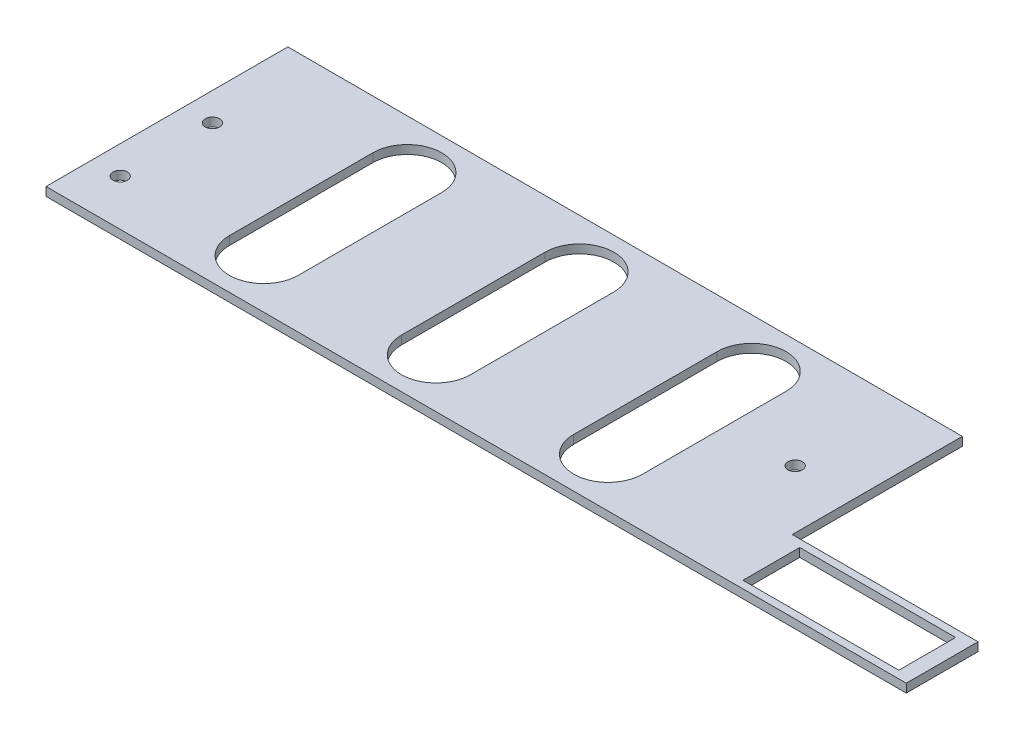
ISO-10303-21;
HEADER;
FILE_DESCRIPTION(('STEP AP214'),'2;1');
FILE_NAME('part.step','',(''),(''),'','','');
FILE_SCHEMA(('AUTOMOTIVE_DESIGN { 1 0 10303 214 1 1 1 1 }'));
ENDSEC;
DATA;
#1=APPLICATION_CONTEXT('core data for automotive mechanical design processes');
#2=APPLICATION_PROTOCOL_DEFINITION('international standard','automotive_design',2000,#1);
#3=PRODUCT_CONTEXT('',#1,'mechanical');
#4=PRODUCT('Part','Part','',(#3));
#5=PRODUCT_RELATED_PRODUCT_CATEGORY('part','',(#4));
#6=PRODUCT_DEFINITION_FORMATION('','',#4);
#7=PRODUCT_DEFINITION_CONTEXT('part definition',#1,'design');
#8=PRODUCT_DEFINITION('design','',#6,#7);
#9=PRODUCT_DEFINITION_SHAPE('','',#8);
#10=(LENGTH_UNIT() NAMED_UNIT(*) SI_UNIT(.MILLI.,.METRE.));
#11=(NAMED_UNIT(*) PLANE_ANGLE_UNIT() SI_UNIT($,.RADIAN.));
#12=(NAMED_UNIT(*) SI_UNIT($,.STERADIAN.) SOLID_ANGLE_UNIT());
#13=UNCERTAINTY_MEASURE_WITH_UNIT(LENGTH_MEASURE(1.E-05),#10,'distance_accuracy_value','');
#14=(GEOMETRIC_REPRESENTATION_CONTEXT(3) GLOBAL_UNCERTAINTY_ASSIGNED_CONTEXT((#13)) GLOBAL_UNIT_ASSIGNED_CONTEXT((#10,
#11,#12)) REPRESENTATION_CONTEXT('',''));
#15=CARTESIAN_POINT('',(0.,0.,0.));
#16=DIRECTION('',(0.,0.,1.));
#17=DIRECTION('',(1.,0.,0.));
#18=AXIS2_PLACEMENT_3D('',#15,#16,#17);
#19=CARTESIAN_POINT('',(0.,3.,0.));
#20=DIRECTION('',(0.,-1.,0.));
#21=DIRECTION('',(0.,0.,-1.));
#22=AXIS2_PLACEMENT_3D('',#19,#20,#21);
#23=PLANE('',#22);
#24=DIRECTION('',(0.,0.,1.));
#25=VECTOR('',#24,1.);
#26=CARTESIAN_POINT('',(29.5972683571293,3.,0.));
#27=LINE('',#26,#25);
#28=CARTESIAN_POINT('',(29.5972683571293,3.,-31.634999999999));
#29=VERTEX_POINT('',#28);
#30=CARTESIAN_POINT('',(29.5972683571293,3.,18.365000000001));
#31=VERTEX_POINT('',#30);
#32=EDGE_CURVE('E353',#29,#31,#27,.T.);
#33=ORIENTED_EDGE('',*,*,#32,.T.);
#34=CARTESIAN_POINT('',(17.5972683571293,3.,18.365000000001));
#35=DIRECTION('',(0.,-1.,0.));
#36=DIRECTION('',(0.,0.,-1.));
#37=AXIS2_PLACEMENT_3D('',#34,#35,#36);
#38=CIRCLE('',#37,12.);
#39=CARTESIAN_POINT('',(5.59726835712926,3.,18.365000000001));
#40=VERTEX_POINT('',#39);
#41=EDGE_CURVE('E357',#31,#40,#38,.T.);
#42=ORIENTED_EDGE('',*,*,#41,.T.);
#43=DIRECTION('',(0.,0.,-1.));
#44=VECTOR('',#43,1.);
#45=CARTESIAN_POINT('',(5.59726835712926,3.,0.));
#46=LINE('',#45,#44);
#47=CARTESIAN_POINT('',(5.59726835712927,3.,-31.634999999999));
#48=VERTEX_POINT('',#47);
#49=EDGE_CURVE('E345',#40,#48,#46,.T.);
#50=ORIENTED_EDGE('',*,*,#49,.T.);
#51=CARTESIAN_POINT('',(17.5972683571293,3.,-31.634999999999));
#52=DIRECTION('',(0.,-1.,0.));
#53=DIRECTION('',(0.,0.,-1.));
#54=AXIS2_PLACEMENT_3D('',#51,#52,#53);
#55=CIRCLE('',#54,12.);
#56=EDGE_CURVE('E349',#48,#29,#55,.T.);
#57=ORIENTED_EDGE('',*,*,#56,.T.);
#58=EDGE_LOOP('',(#33,#42,#50,#57));
#59=FACE_BOUND('',#58,.T.);
#60=DIRECTION('',(0.,0.,1.));
#61=VECTOR('',#60,1.);
#62=CARTESIAN_POINT('',(-90.4027316428707,3.,0.));
#63=LINE('',#62,#61);
#64=CARTESIAN_POINT('',(-90.4027316428707,3.,-31.6349999999999));
#65=VERTEX_POINT('',#64);
#66=CARTESIAN_POINT('',(-90.4027316428707,3.,18.3650000000001));
#67=VERTEX_POINT('',#66);
#68=EDGE_CURVE('E337',#65,#67,#63,.T.);
#69=ORIENTED_EDGE('',*,*,#68,.T.);
#70=CARTESIAN_POINT('',(-102.402731642871,3.,18.3650000000001));
#71=DIRECTION('',(0.,-1.,0.));
#72=DIRECTION('',(0.,0.,-1.));
#73=AXIS2_PLACEMENT_3D('',#70,#71,#72);
#74=CIRCLE('',#73,12.);
#75=CARTESIAN_POINT('',(-114.402731642871,3.,18.3650000000001));
#76=VERTEX_POINT('',#75);
#77=EDGE_CURVE('E341',#67,#76,#74,.T.);
#78=ORIENTED_EDGE('',*,*,#77,.T.);
#79=DIRECTION('',(0.,0.,-1.));
#80=VECTOR('',#79,1.);
#81=CARTESIAN_POINT('',(-114.402731642871,3.,0.));
#82=LINE('',#81,#80);
#83=CARTESIAN_POINT('',(-114.402731642871,3.,-31.6349999999999));
#84=VERTEX_POINT('',#83);
#85=EDGE_CURVE('E332',#76,#84,#82,.T.);
#86=ORIENTED_EDGE('',*,*,#85,.T.);
#87=CARTESIAN_POINT('',(-102.402731642871,3.,-31.6349999999999));
#88=DIRECTION('',(0.,-1.,0.));
#89=DIRECTION('',(0.,0.,-1.));
#90=AXIS2_PLACEMENT_3D('',#87,#88,#89);
#91=CIRCLE('',#90,12.);
#92=EDGE_CURVE('E231',#84,#65,#91,.T.);
#93=ORIENTED_EDGE('',*,*,#92,.T.);
#94=EDGE_LOOP('',(#69,#78,#86,#93));
#95=FACE_BOUND('',#94,.T.);
#96=DIRECTION('',(0.,0.,1.));
#97=VECTOR('',#96,1.);
#98=CARTESIAN_POINT('',(-30.4027316428707,3.,0.));
#99=LINE('',#98,#97);
#100=CARTESIAN_POINT('',(-30.4027316428707,3.,-31.6349999999995));
#101=VERTEX_POINT('',#100);
#102=CARTESIAN_POINT('',(-30.4027316428707,3.,18.3650000000005));
#103=VERTEX_POINT('',#102);
#104=EDGE_CURVE('E324',#101,#103,#99,.T.);
#105=ORIENTED_EDGE('',*,*,#104,.T.);
#106=CARTESIAN_POINT('',(-42.4027316428707,3.,18.3650000000005));
#107=DIRECTION('',(0.,-1.,0.));
#108=DIRECTION('',(0.,0.,-1.));
#109=AXIS2_PLACEMENT_3D('',#106,#107,#108);
#110=CIRCLE('',#109,12.);
#111=CARTESIAN_POINT('',(-54.4027316428707,3.,18.3650000000005));
#112=VERTEX_POINT('',#111);
#113=EDGE_CURVE('E328',#103,#112,#110,.T.);
#114=ORIENTED_EDGE('',*,*,#113,.T.);
#115=DIRECTION('',(0.,0.,-1.));
#116=VECTOR('',#115,1.);
#117=CARTESIAN_POINT('',(-54.4027316428707,3.,0.));
#118=LINE('',#117,#116);
#119=CARTESIAN_POINT('',(-54.4027316428707,3.,-31.6349999999995));
#120=VERTEX_POINT('',#119);
#121=EDGE_CURVE('E309',#112,#120,#118,.T.);
#122=ORIENTED_EDGE('',*,*,#121,.T.);
#123=CARTESIAN_POINT('',(-42.4027316428707,3.,-31.6349999999995));
#124=DIRECTION('',(0.,-1.,0.));
#125=DIRECTION('',(0.,0.,-1.));
#126=AXIS2_PLACEMENT_3D('',#123,#124,#125);
#127=CIRCLE('',#126,12.);
#128=EDGE_CURVE('E320',#120,#101,#127,.T.);
#129=ORIENTED_EDGE('',*,*,#128,.T.);
#130=EDGE_LOOP('',(#105,#114,#122,#129));
#131=FACE_BOUND('',#130,.T.);
#132=DIRECTION('',(0.,0.,1.));
#133=VECTOR('',#132,1.);
#134=CARTESIAN_POINT('',(79.1091633125255,3.,15.6877455438227));
#135=LINE('',#134,#133);
#136=CARTESIAN_POINT('',(79.1091633125255,3.,13.11));
#137=VERTEX_POINT('',#136);
#138=CARTESIAN_POINT('',(79.1091633125255,3.,32.8870446375442));
#139=VERTEX_POINT('',#138);
#140=EDGE_CURVE('E421',#137,#139,#135,.T.);
#141=ORIENTED_EDGE('',*,*,#140,.F.);
#142=DIRECTION('',(1.,0.,0.));
#143=VECTOR('',#142,1.);
#144=CARTESIAN_POINT('',(0.,3.,13.11));
#145=LINE('',#144,#143);
#146=CARTESIAN_POINT('',(133.425707504545,3.,13.11));
#147=VERTEX_POINT('',#146);
#148=EDGE_CURVE('E374',#137,#147,#145,.T.);
#149=ORIENTED_EDGE('',*,*,#148,.T.);
#150=DIRECTION('',(0.,0.,1.));
#151=VECTOR('',#150,1.);
#152=CARTESIAN_POINT('',(133.425707504545,3.,0.));
#153=LINE('',#152,#151);
#154=CARTESIAN_POINT('',(133.425707504545,3.,32.8870446375442));
#155=VERTEX_POINT('',#154);
#156=EDGE_CURVE('E384',#147,#155,#153,.T.);
#157=ORIENTED_EDGE('',*,*,#156,.T.);
#158=DIRECTION('',(1.,0.,0.));
#159=VECTOR('',#158,1.);
#160=CARTESIAN_POINT('',(114.261515643518,3.,32.8870446375442));
#161=LINE('',#160,#159);
#162=EDGE_CURVE('E424',#139,#155,#161,.T.);
#163=ORIENTED_EDGE('',*,*,#162,.F.);
#164=EDGE_LOOP('',(#141,#149,#157,#163));
#165=FACE_BOUND('',#164,.T.);
#166=CARTESIAN_POINT('',(53.6619509149034,3.,-10.7474999223063));
#167=DIRECTION('',(0.,1.,0.));
#168=DIRECTION('',(0.,0.,1.));
#169=AXIS2_PLACEMENT_3D('',#166,#167,#168);
#170=CIRCLE('',#169,2.50000000000001);
#171=CARTESIAN_POINT('',(53.6619509149034,3.,-8.24749992230629));
#172=VERTEX_POINT('',#171);
#173=EDGE_CURVE('E438',#172,#172,#170,.T.);
#174=ORIENTED_EDGE('',*,*,#173,.F.);
#175=EDGE_LOOP('',(#174));
#176=FACE_BOUND('',#175,.T.);
#177=DIRECTION('',(0.,0.,-1.));
#178=VECTOR('',#177,1.);
#179=CARTESIAN_POINT('',(73.9119509148827,3.,-28.7699999999858));
#180=LINE('',#179,#178);
#181=CARTESIAN_POINT('',(73.9119509148827,3.,10.5));
#182=VERTEX_POINT('',#181);
#183=CARTESIAN_POINT('',(73.9119509148862,3.,-48.7699999999858));
#184=VERTEX_POINT('',#183);
#185=EDGE_CURVE('E459',#182,#184,#180,.T.);
#186=ORIENTED_EDGE('',*,*,#185,.T.);
#187=DIRECTION('',(1.,0.,0.));
#188=VECTOR('',#187,1.);
#189=CARTESIAN_POINT('',(73.9119509148862,3.,-48.7699999999858));
#190=LINE('',#189,#188);
#191=CARTESIAN_POINT('',(-161.174292495454,3.,-48.7699999999998));
#192=VERTEX_POINT('',#191);
#193=EDGE_CURVE('E400',#192,#184,#190,.T.);
#194=ORIENTED_EDGE('',*,*,#193,.F.);
#195=DIRECTION('',(0.,0.,1.));
#196=VECTOR('',#195,1.);
#197=CARTESIAN_POINT('',(-161.174292495455,3.,-28.7699999999998));
#198=LINE('',#197,#196);
#199=CARTESIAN_POINT('',(-161.174292495455,3.,35.5));
#200=VERTEX_POINT('',#199);
#201=EDGE_CURVE('E446',#192,#200,#198,.T.);
#202=ORIENTED_EDGE('',*,*,#201,.T.);
#203=DIRECTION('',(1.,0.,0.));
#204=VECTOR('',#203,1.);
#205=CARTESIAN_POINT('',(-161.174292495455,3.,35.5));
#206=LINE('',#205,#204);
#207=CARTESIAN_POINT('',(138.625707504545,3.,35.5));
#208=VERTEX_POINT('',#207);
#209=EDGE_CURVE('E449',#200,#208,#206,.T.);
#210=ORIENTED_EDGE('',*,*,#209,.T.);
#211=DIRECTION('',(0.,0.,-1.));
#212=VECTOR('',#211,1.);
#213=CARTESIAN_POINT('',(138.625707504545,3.,10.5));
#214=LINE('',#213,#212);
#215=CARTESIAN_POINT('',(138.625707504545,3.,10.5));
#216=VERTEX_POINT('',#215);
#217=EDGE_CURVE('E453',#208,#216,#214,.T.);
#218=ORIENTED_EDGE('',*,*,#217,.T.);
#219=DIRECTION('',(-1.,0.,0.));
#220=VECTOR('',#219,1.);
#221=CARTESIAN_POINT('',(73.9119509148827,3.,10.5));
#222=LINE('',#221,#220);
#223=EDGE_CURVE('E456',#216,#182,#222,.T.);
#224=ORIENTED_EDGE('',*,*,#223,.T.);
#225=EDGE_LOOP('',(#186,#194,#202,#210,#218,#224));
#226=FACE_BOUND('',#225,.T.);
#227=CARTESIAN_POINT('',(-151.374292495455,3.,19.4325000000002));
#228=DIRECTION('',(0.,1.,0.));
#229=DIRECTION('',(0.,0.,1.));
#230=AXIS2_PLACEMENT_3D('',#227,#228,#229);
#231=CIRCLE('',#230,2.5);
#232=CARTESIAN_POINT('',(-151.374292495455,3.,21.9325000000002));
#233=VERTEX_POINT('',#232);
#234=EDGE_CURVE('E413',#233,#233,#231,.T.);
#235=ORIENTED_EDGE('',*,*,#234,.F.);
#236=EDGE_LOOP('',(#235));
#237=FACE_BOUND('',#236,.T.);
#238=CARTESIAN_POINT('',(-151.374292495455,3.,-12.7024999999998));
#239=DIRECTION('',(0.,1.,0.));
#240=DIRECTION('',(0.,0.,1.));
#241=AXIS2_PLACEMENT_3D('',#238,#239,#240);
#242=CIRCLE('',#241,2.5);
#243=CARTESIAN_POINT('',(-151.374292495455,3.,-10.2024999999998));
#244=VERTEX_POINT('',#243);
#245=EDGE_CURVE('E405',#244,#244,#242,.T.);
#246=ORIENTED_EDGE('',*,*,#245,.F.);
#247=EDGE_LOOP('',(#246));
#248=FACE_BOUND('',#247,.T.);
#249=ADVANCED_FACE('F38',(#59,#95,#131,#165,#176,#226,#237,#248),#23,.F.);
#250=CARTESIAN_POINT('',(0.,0.,0.));
#251=DIRECTION('',(0.,-1.,0.));
#252=DIRECTION('',(0.,0.,-1.));
#253=AXIS2_PLACEMENT_3D('',#250,#251,#252);
#254=PLANE('',#253);
#255=CARTESIAN_POINT('',(17.5972683571293,0.,18.365000000001));
#256=DIRECTION('',(0.,-1.,0.));
#257=DIRECTION('',(0.,0.,-1.));
#258=AXIS2_PLACEMENT_3D('',#255,#256,#257);
#259=CIRCLE('',#258,12.);
#260=CARTESIAN_POINT('',(29.5972683571293,0.,18.365000000001));
#261=VERTEX_POINT('',#260);
#262=CARTESIAN_POINT('',(5.59726835712926,0.,18.365000000001));
#263=VERTEX_POINT('',#262);
#264=EDGE_CURVE('E266',#261,#263,#259,.T.);
#265=ORIENTED_EDGE('',*,*,#264,.F.);
#266=DIRECTION('',(0.,0.,1.));
#267=VECTOR('',#266,1.);
#268=CARTESIAN_POINT('',(29.5972683571293,0.,18.365000000001));
#269=LINE('',#268,#267);
#270=CARTESIAN_POINT('',(29.5972683571293,0.,-31.634999999999));
#271=VERTEX_POINT('',#270);
#272=EDGE_CURVE('E276',#271,#261,#269,.T.);
#273=ORIENTED_EDGE('',*,*,#272,.F.);
#274=CARTESIAN_POINT('',(17.5972683571293,0.,-31.634999999999));
#275=DIRECTION('',(0.,-1.,0.));
#276=DIRECTION('',(0.,0.,-1.));
#277=AXIS2_PLACEMENT_3D('',#274,#275,#276);
#278=CIRCLE('',#277,12.);
#279=CARTESIAN_POINT('',(5.59726835712927,0.,-31.634999999999));
#280=VERTEX_POINT('',#279);
#281=EDGE_CURVE('E272',#280,#271,#278,.T.);
#282=ORIENTED_EDGE('',*,*,#281,.F.);
#283=DIRECTION('',(0.,0.,-1.));
#284=VECTOR('',#283,1.);
#285=CARTESIAN_POINT('',(5.59726835712926,0.,18.365000000001));
#286=LINE('',#285,#284);
#287=EDGE_CURVE('E269',#263,#280,#286,.T.);
#288=ORIENTED_EDGE('',*,*,#287,.F.);
#289=EDGE_LOOP('',(#265,#273,#282,#288));
#290=FACE_BOUND('',#289,.T.);
#291=CARTESIAN_POINT('',(-102.402731642871,0.,18.3650000000001));
#292=DIRECTION('',(0.,-1.,0.));
#293=DIRECTION('',(0.,0.,-1.));
#294=AXIS2_PLACEMENT_3D('',#291,#292,#293);
#295=CIRCLE('',#294,12.);
#296=CARTESIAN_POINT('',(-90.4027316428707,0.,18.3650000000001));
#297=VERTEX_POINT('',#296);
#298=CARTESIAN_POINT('',(-114.402731642871,0.,18.3650000000001));
#299=VERTEX_POINT('',#298);
#300=EDGE_CURVE('E245',#297,#299,#295,.T.);
#301=ORIENTED_EDGE('',*,*,#300,.F.);
#302=DIRECTION('',(0.,0.,1.));
#303=VECTOR('',#302,1.);
#304=CARTESIAN_POINT('',(-90.4027316428707,0.,18.3650000000001));
#305=LINE('',#304,#303);
#306=CARTESIAN_POINT('',(-90.4027316428707,0.,-31.6349999999999));
#307=VERTEX_POINT('',#306);
#308=EDGE_CURVE('E250',#307,#297,#305,.T.);
#309=ORIENTED_EDGE('',*,*,#308,.F.);
#310=CARTESIAN_POINT('',(-102.402731642871,0.,-31.6349999999999));
#311=DIRECTION('',(0.,-1.,0.));
#312=DIRECTION('',(0.,0.,-1.));
#313=AXIS2_PLACEMENT_3D('',#310,#311,#312);
#314=CIRCLE('',#313,12.);
#315=CARTESIAN_POINT('',(-114.402731642871,0.,-31.6349999999999));
#316=VERTEX_POINT('',#315);
#317=EDGE_CURVE('E228',#316,#307,#314,.T.);
#318=ORIENTED_EDGE('',*,*,#317,.F.);
#319=DIRECTION('',(0.,0.,-1.));
#320=VECTOR('',#319,1.);
#321=CARTESIAN_POINT('',(-114.402731642871,0.,18.3650000000001));
#322=LINE('',#321,#320);
#323=EDGE_CURVE('E239',#299,#316,#322,.T.);
#324=ORIENTED_EDGE('',*,*,#323,.F.);
#325=EDGE_LOOP('',(#301,#309,#318,#324));
#326=FACE_BOUND('',#325,.T.);
#327=CARTESIAN_POINT('',(-42.4027316428707,0.,18.3650000000005));
#328=DIRECTION('',(0.,-1.,0.));
#329=DIRECTION('',(0.,0.,-1.));
#330=AXIS2_PLACEMENT_3D('',#327,#328,#329);
#331=CIRCLE('',#330,12.);
#332=CARTESIAN_POINT('',(-30.4027316428707,0.,18.3650000000005));
#333=VERTEX_POINT('',#332);
#334=CARTESIAN_POINT('',(-54.4027316428707,0.,18.3650000000005));
#335=VERTEX_POINT('',#334);
#336=EDGE_CURVE('E261',#333,#335,#331,.T.);
#337=ORIENTED_EDGE('',*,*,#336,.F.);
#338=DIRECTION('',(0.,0.,1.));
#339=VECTOR('',#338,1.);
#340=CARTESIAN_POINT('',(-30.4027316428707,0.,18.3650000000005));
#341=LINE('',#340,#339);
#342=CARTESIAN_POINT('',(-30.4027316428707,0.,-31.6349999999995));
#343=VERTEX_POINT('',#342);
#344=EDGE_CURVE('E301',#343,#333,#341,.T.);
#345=ORIENTED_EDGE('',*,*,#344,.F.);
#346=CARTESIAN_POINT('',(-42.4027316428707,0.,-31.6349999999995));
#347=DIRECTION('',(0.,-1.,0.));
#348=DIRECTION('',(0.,0.,-1.));
#349=AXIS2_PLACEMENT_3D('',#346,#347,#348);
#350=CIRCLE('',#349,12.);
#351=CARTESIAN_POINT('',(-54.4027316428707,0.,-31.6349999999995));
#352=VERTEX_POINT('',#351);
#353=EDGE_CURVE('E297',#352,#343,#350,.T.);
#354=ORIENTED_EDGE('',*,*,#353,.F.);
#355=DIRECTION('',(0.,0.,-1.));
#356=VECTOR('',#355,1.);
#357=CARTESIAN_POINT('',(-54.4027316428707,0.,18.3650000000005));
#358=LINE('',#357,#356);
#359=EDGE_CURVE('E293',#335,#352,#358,.T.);
#360=ORIENTED_EDGE('',*,*,#359,.F.);
#361=EDGE_LOOP('',(#337,#345,#354,#360));
#362=FACE_BOUND('',#361,.T.);
#363=DIRECTION('',(1.,0.,0.));
#364=VECTOR('',#363,1.);
#365=CARTESIAN_POINT('',(79.1091633125255,0.,13.11));
#366=LINE('',#365,#364);
#367=CARTESIAN_POINT('',(79.1091633125255,0.,13.11));
#368=VERTEX_POINT('',#367);
#369=CARTESIAN_POINT('',(133.425707504545,0.,13.11));
#370=VERTEX_POINT('',#369);
#371=EDGE_CURVE('E361',#368,#370,#366,.T.);
#372=ORIENTED_EDGE('',*,*,#371,.F.);
#373=DIRECTION('',(0.,0.,1.));
#374=VECTOR('',#373,1.);
#375=CARTESIAN_POINT('',(79.1091633125255,0.,15.6877455438227));
#376=LINE('',#375,#374);
#377=CARTESIAN_POINT('',(79.1091633125255,0.,32.8870446375442));
#378=VERTEX_POINT('',#377);
#379=EDGE_CURVE('E417',#368,#378,#376,.T.);
#380=ORIENTED_EDGE('',*,*,#379,.T.);
#381=DIRECTION('',(1.,0.,0.));
#382=VECTOR('',#381,1.);
#383=CARTESIAN_POINT('',(132.625707504543,0.,32.8870446375442));
#384=LINE('',#383,#382);
#385=CARTESIAN_POINT('',(133.425707504545,0.,32.8870446375442));
#386=VERTEX_POINT('',#385);
#387=EDGE_CURVE('E425',#378,#386,#384,.T.);
#388=ORIENTED_EDGE('',*,*,#387,.T.);
#389=DIRECTION('',(0.,0.,1.));
#390=VECTOR('',#389,1.);
#391=CARTESIAN_POINT('',(133.425707504545,0.,32.8870446375442));
#392=LINE('',#391,#390);
#393=EDGE_CURVE('E365',#370,#386,#392,.T.);
#394=ORIENTED_EDGE('',*,*,#393,.F.);
#395=EDGE_LOOP('',(#372,#380,#388,#394));
#396=FACE_BOUND('',#395,.T.);
#397=CARTESIAN_POINT('',(-151.374292495455,0.,19.4325000000002));
#398=DIRECTION('',(0.,1.,0.));
#399=DIRECTION('',(0.,0.,1.));
#400=AXIS2_PLACEMENT_3D('',#397,#398,#399);
#401=CIRCLE('',#400,2.5);
#402=CARTESIAN_POINT('',(-151.374292495455,0.,21.9325000000002));
#403=VERTEX_POINT('',#402);
#404=EDGE_CURVE('E409',#403,#403,#401,.T.);
#405=ORIENTED_EDGE('',*,*,#404,.T.);
#406=EDGE_LOOP('',(#405));
#407=FACE_BOUND('',#406,.T.);
#408=DIRECTION('',(0.,0.,1.));
#409=VECTOR('',#408,1.);
#410=CARTESIAN_POINT('',(-161.174292495455,0.,25.4999999999999));
#411=LINE('',#410,#409);
#412=CARTESIAN_POINT('',(-161.174292495454,0.,-48.7699999999998));
#413=VERTEX_POINT('',#412);
#414=CARTESIAN_POINT('',(-161.174292495455,0.,35.5));
#415=VERTEX_POINT('',#414);
#416=EDGE_CURVE('E442',#413,#415,#411,.T.);
#417=ORIENTED_EDGE('',*,*,#416,.F.);
#418=DIRECTION('',(-1.,0.,0.));
#419=VECTOR('',#418,1.);
#420=CARTESIAN_POINT('',(73.9119509148862,0.,-48.7699999999858));
#421=LINE('',#420,#419);
#422=CARTESIAN_POINT('',(73.9119509148862,0.,-48.7699999999858));
#423=VERTEX_POINT('',#422);
#424=EDGE_CURVE('E392',#423,#413,#421,.T.);
#425=ORIENTED_EDGE('',*,*,#424,.F.);
#426=DIRECTION('',(0.,0.,-1.));
#427=VECTOR('',#426,1.);
#428=CARTESIAN_POINT('',(73.9119509148827,0.,-28.7699999999858));
#429=LINE('',#428,#427);
#430=CARTESIAN_POINT('',(73.9119509148827,0.,10.5));
#431=VERTEX_POINT('',#430);
#432=EDGE_CURVE('E450',#431,#423,#429,.T.);
#433=ORIENTED_EDGE('',*,*,#432,.F.);
#434=DIRECTION('',(-1.,0.,0.));
#435=VECTOR('',#434,1.);
#436=CARTESIAN_POINT('',(73.9119509148827,0.,10.5));
#437=LINE('',#436,#435);
#438=CARTESIAN_POINT('',(138.625707504545,0.,10.5));
#439=VERTEX_POINT('',#438);
#440=EDGE_CURVE('E471',#439,#431,#437,.T.);
#441=ORIENTED_EDGE('',*,*,#440,.F.);
#442=DIRECTION('',(0.,0.,-1.));
#443=VECTOR('',#442,1.);
#444=CARTESIAN_POINT('',(138.625707504545,0.,10.5));
#445=LINE('',#444,#443);
#446=CARTESIAN_POINT('',(138.625707504545,0.,35.5));
#447=VERTEX_POINT('',#446);
#448=EDGE_CURVE('E468',#447,#439,#445,.T.);
#449=ORIENTED_EDGE('',*,*,#448,.F.);
#450=DIRECTION('',(1.,0.,0.));
#451=VECTOR('',#450,1.);
#452=CARTESIAN_POINT('',(-161.174292495455,0.,35.5));
#453=LINE('',#452,#451);
#454=EDGE_CURVE('E465',#415,#447,#453,.T.);
#455=ORIENTED_EDGE('',*,*,#454,.F.);
#456=EDGE_LOOP('',(#417,#425,#433,#441,#449,#455));
#457=FACE_BOUND('',#456,.T.);
#458=CARTESIAN_POINT('',(53.6619509149034,0.,-10.7474999223063));
#459=DIRECTION('',(0.,1.,0.));
#460=DIRECTION('',(0.,0.,1.));
#461=AXIS2_PLACEMENT_3D('',#458,#459,#460);
#462=CIRCLE('',#461,2.50000000000001);
#463=CARTESIAN_POINT('',(53.6619509149034,0.,-8.24749992230629));
#464=VERTEX_POINT('',#463);
#465=EDGE_CURVE('E437',#464,#464,#462,.T.);
#466=ORIENTED_EDGE('',*,*,#465,.T.);
#467=EDGE_LOOP('',(#466));
#468=FACE_BOUND('',#467,.T.);
#469=CARTESIAN_POINT('',(-151.374292495455,0.,-12.7024999999998));
#470=DIRECTION('',(0.,1.,0.));
#471=DIRECTION('',(0.,0.,1.));
#472=AXIS2_PLACEMENT_3D('',#469,#470,#471);
#473=CIRCLE('',#472,2.5);
#474=CARTESIAN_POINT('',(-151.374292495455,0.,-10.2024999999998));
#475=VERTEX_POINT('',#474);
#476=EDGE_CURVE('E404',#475,#475,#473,.T.);
#477=ORIENTED_EDGE('',*,*,#476,.T.);
#478=EDGE_LOOP('',(#477));
#479=FACE_BOUND('',#478,.T.);
#480=ADVANCED_FACE('F247',(#290,#326,#362,#396,#407,#457,#468,#479),#254,.T.);
#481=CARTESIAN_POINT('',(-161.174292495455,3.,25.4999999999999));
#482=DIRECTION('',(1.,0.,0.));
#483=DIRECTION('',(0.,0.,-1.));
#484=AXIS2_PLACEMENT_3D('',#481,#482,#483);
#485=PLANE('',#484);
#486=ORIENTED_EDGE('',*,*,#416,.T.);
#487=DIRECTION('',(0.,-1.,0.));
#488=VECTOR('',#487,1.);
#489=CARTESIAN_POINT('',(-161.174292495455,3.,35.5));
#490=LINE('',#489,#488);
#491=EDGE_CURVE('E11',#200,#415,#490,.T.);
#492=ORIENTED_EDGE('',*,*,#491,.F.);
#493=ORIENTED_EDGE('',*,*,#201,.F.);
#494=DIRECTION('',(0.,1.,0.));
#495=VECTOR('',#494,1.);
#496=CARTESIAN_POINT('',(-161.174292495454,3.,-48.7699999999998));
#497=LINE('',#496,#495);
#498=EDGE_CURVE('E396',#413,#192,#497,.T.);
#499=ORIENTED_EDGE('',*,*,#498,.F.);
#500=EDGE_LOOP('',(#486,#492,#493,#499));
#501=FACE_BOUND('',#500,.T.);
#502=ADVANCED_FACE('F40',(#501),#485,.F.);
#503=CARTESIAN_POINT('',(-161.174292495455,3.,35.5));
#504=DIRECTION('',(0.,0.,-1.));
#505=DIRECTION('',(-1.,0.,0.));
#506=AXIS2_PLACEMENT_3D('',#503,#504,#505);
#507=PLANE('',#506);
#508=ORIENTED_EDGE('',*,*,#454,.T.);
#509=DIRECTION('',(0.,-1.,0.));
#510=VECTOR('',#509,1.);
#511=CARTESIAN_POINT('',(138.625707504545,3.,35.5));
#512=LINE('',#511,#510);
#513=EDGE_CURVE('E47',#208,#447,#512,.T.);
#514=ORIENTED_EDGE('',*,*,#513,.F.);
#515=ORIENTED_EDGE('',*,*,#209,.F.);
#516=ORIENTED_EDGE('',*,*,#491,.T.);
#517=EDGE_LOOP('',(#508,#514,#515,#516));
#518=FACE_BOUND('',#517,.T.);
#519=ADVANCED_FACE('F514',(#518),#507,.F.);
#520=CARTESIAN_POINT('',(138.625707504545,3.,10.5));
#521=DIRECTION('',(-1.,0.,0.));
#522=DIRECTION('',(0.,0.,1.));
#523=AXIS2_PLACEMENT_3D('',#520,#521,#522);
#524=PLANE('',#523);
#525=ORIENTED_EDGE('',*,*,#448,.T.);
#526=DIRECTION('',(0.,-1.,0.));
#527=VECTOR('',#526,1.);
#528=CARTESIAN_POINT('',(138.625707504545,3.,10.5));
#529=LINE('',#528,#527);
#530=EDGE_CURVE('E479',#216,#439,#529,.T.);
#531=ORIENTED_EDGE('',*,*,#530,.F.);
#532=ORIENTED_EDGE('',*,*,#217,.F.);
#533=ORIENTED_EDGE('',*,*,#513,.T.);
#534=EDGE_LOOP('',(#525,#531,#532,#533));
#535=FACE_BOUND('',#534,.T.);
#536=ADVANCED_FACE('F488',(#535),#524,.F.);
#537=CARTESIAN_POINT('',(73.9119509148827,3.,10.5));
#538=DIRECTION('',(0.,0.,1.));
#539=DIRECTION('',(1.,0.,0.));
#540=AXIS2_PLACEMENT_3D('',#537,#538,#539);
#541=PLANE('',#540);
#542=ORIENTED_EDGE('',*,*,#440,.T.);
#543=DIRECTION('',(0.,-1.,0.));
#544=VECTOR('',#543,1.);
#545=CARTESIAN_POINT('',(73.9119509148827,3.,10.5));
#546=LINE('',#545,#544);
#547=EDGE_CURVE('E462',#182,#431,#546,.T.);
#548=ORIENTED_EDGE('',*,*,#547,.F.);
#549=ORIENTED_EDGE('',*,*,#223,.F.);
#550=ORIENTED_EDGE('',*,*,#530,.T.);
#551=EDGE_LOOP('',(#542,#548,#549,#550));
#552=FACE_BOUND('',#551,.T.);
#553=ADVANCED_FACE('F500',(#552),#541,.F.);
#554=CARTESIAN_POINT('',(73.9119509148827,3.,-28.7699999999858));
#555=DIRECTION('',(-1.,0.,0.));
#556=DIRECTION('',(0.,0.,1.));
#557=AXIS2_PLACEMENT_3D('',#554,#555,#556);
#558=PLANE('',#557);
#559=ORIENTED_EDGE('',*,*,#432,.T.);
#560=DIRECTION('',(0.,-1.,0.));
#561=VECTOR('',#560,1.);
#562=CARTESIAN_POINT('',(73.9119509148862,3.,-48.7699999999858));
#563=LINE('',#562,#561);
#564=EDGE_CURVE('E388',#184,#423,#563,.T.);
#565=ORIENTED_EDGE('',*,*,#564,.F.);
#566=ORIENTED_EDGE('',*,*,#185,.F.);
#567=ORIENTED_EDGE('',*,*,#547,.T.);
#568=EDGE_LOOP('',(#559,#565,#566,#567));
#569=FACE_BOUND('',#568,.T.);
#570=ADVANCED_FACE('F504',(#569),#558,.F.);
#571=CARTESIAN_POINT('',(53.6619509149034,3.,-10.7474999223063));
#572=DIRECTION('',(0.,-1.,0.));
#573=DIRECTION('',(0.,0.,-1.));
#574=AXIS2_PLACEMENT_3D('',#571,#572,#573);
#575=CYLINDRICAL_SURFACE('',#574,2.50000000000001);
#576=ORIENTED_EDGE('',*,*,#173,.T.);
#577=EDGE_LOOP('',(#576));
#578=FACE_BOUND('',#577,.T.);
#579=ORIENTED_EDGE('',*,*,#465,.F.);
#580=EDGE_LOOP('',(#579));
#581=FACE_BOUND('',#580,.T.);
#582=ADVANCED_FACE('F531',(#578,#581),#575,.F.);
#583=CARTESIAN_POINT('',(79.1091633125255,3.,15.6877455438227));
#584=DIRECTION('',(1.,0.,0.));
#585=DIRECTION('',(0.,0.,-1.));
#586=AXIS2_PLACEMENT_3D('',#583,#584,#585);
#587=PLANE('',#586);
#588=ORIENTED_EDGE('',*,*,#379,.F.);
#589=DIRECTION('',(0.,-1.,0.));
#590=VECTOR('',#589,1.);
#591=CARTESIAN_POINT('',(79.1091633125255,10.,13.11));
#592=LINE('',#591,#590);
#593=EDGE_CURVE('E369',#137,#368,#592,.T.);
#594=ORIENTED_EDGE('',*,*,#593,.F.);
#595=ORIENTED_EDGE('',*,*,#140,.T.);
#596=DIRECTION('',(0.,-1.,0.));
#597=VECTOR('',#596,1.);
#598=CARTESIAN_POINT('',(79.1091633125255,3.,32.8870446375442));
#599=LINE('',#598,#597);
#600=EDGE_CURVE('E428',#139,#378,#599,.T.);
#601=ORIENTED_EDGE('',*,*,#600,.T.);
#602=EDGE_LOOP('',(#588,#594,#595,#601));
#603=FACE_BOUND('',#602,.T.);
#604=ADVANCED_FACE('F554',(#603),#587,.T.);
#605=CARTESIAN_POINT('',(132.625707504543,3.,32.8870446375442));
#606=DIRECTION('',(0.,0.,-1.));
#607=DIRECTION('',(-1.,0.,0.));
#608=AXIS2_PLACEMENT_3D('',#605,#606,#607);
#609=PLANE('',#608);
#610=ORIENTED_EDGE('',*,*,#387,.F.);
#611=ORIENTED_EDGE('',*,*,#600,.F.);
#612=ORIENTED_EDGE('',*,*,#162,.T.);
#613=DIRECTION('',(0.,-1.,0.));
#614=VECTOR('',#613,1.);
#615=CARTESIAN_POINT('',(133.425707504545,10.,32.8870446375442));
#616=LINE('',#615,#614);
#617=EDGE_CURVE('E370',#155,#386,#616,.T.);
#618=ORIENTED_EDGE('',*,*,#617,.T.);
#619=EDGE_LOOP('',(#610,#611,#612,#618));
#620=FACE_BOUND('',#619,.T.);
#621=ADVANCED_FACE('F560',(#620),#609,.T.);
#622=CARTESIAN_POINT('',(-151.374292495455,3.,19.4325000000002));
#623=DIRECTION('',(0.,-1.,0.));
#624=DIRECTION('',(0.,0.,-1.));
#625=AXIS2_PLACEMENT_3D('',#622,#623,#624);
#626=CYLINDRICAL_SURFACE('',#625,2.5);
#627=ORIENTED_EDGE('',*,*,#234,.T.);
#628=EDGE_LOOP('',(#627));
#629=FACE_BOUND('',#628,.T.);
#630=ORIENTED_EDGE('',*,*,#404,.F.);
#631=EDGE_LOOP('',(#630));
#632=FACE_BOUND('',#631,.T.);
#633=ADVANCED_FACE('F569',(#629,#632),#626,.F.);
#634=CARTESIAN_POINT('',(-151.374292495455,3.,-12.7024999999998));
#635=DIRECTION('',(0.,-1.,0.));
#636=DIRECTION('',(0.,0.,-1.));
#637=AXIS2_PLACEMENT_3D('',#634,#635,#636);
#638=CYLINDRICAL_SURFACE('',#637,2.5);
#639=ORIENTED_EDGE('',*,*,#245,.T.);
#640=EDGE_LOOP('',(#639));
#641=FACE_BOUND('',#640,.T.);
#642=ORIENTED_EDGE('',*,*,#476,.F.);
#643=EDGE_LOOP('',(#642));
#644=FACE_BOUND('',#643,.T.);
#645=ADVANCED_FACE('F576',(#641,#644),#638,.F.);
#646=CARTESIAN_POINT('',(2.90205951305812E-12,0.,-48.7699999999902));
#647=DIRECTION('',(0.,0.,-1.));
#648=DIRECTION('',(-1.,0.,0.));
#649=AXIS2_PLACEMENT_3D('',#646,#647,#648);
#650=PLANE('',#649);
#651=ORIENTED_EDGE('',*,*,#564,.T.);
#652=ORIENTED_EDGE('',*,*,#424,.T.);
#653=ORIENTED_EDGE('',*,*,#498,.T.);
#654=ORIENTED_EDGE('',*,*,#193,.T.);
#655=EDGE_LOOP('',(#651,#652,#653,#654));
#656=FACE_BOUND('',#655,.T.);
#657=ADVANCED_FACE('F510',(#656),#650,.T.);
#658=CARTESIAN_POINT('',(133.425707504545,10.,32.8870446375442));
#659=DIRECTION('',(1.,0.,0.));
#660=DIRECTION('',(0.,0.,-1.));
#661=AXIS2_PLACEMENT_3D('',#658,#659,#660);
#662=PLANE('',#661);
#663=DIRECTION('',(0.,-1.,0.));
#664=VECTOR('',#663,1.);
#665=CARTESIAN_POINT('',(133.425707504545,10.,13.11));
#666=LINE('',#665,#664);
#667=EDGE_CURVE('E375',#147,#370,#666,.T.);
#668=ORIENTED_EDGE('',*,*,#667,.T.);
#669=ORIENTED_EDGE('',*,*,#393,.T.);
#670=ORIENTED_EDGE('',*,*,#617,.F.);
#671=ORIENTED_EDGE('',*,*,#156,.F.);
#672=EDGE_LOOP('',(#668,#669,#670,#671));
#673=FACE_BOUND('',#672,.T.);
#674=ADVANCED_FACE('F592',(#673),#662,.F.);
#675=CARTESIAN_POINT('',(79.1091633125255,10.,13.11));
#676=DIRECTION('',(0.,0.,-1.));
#677=DIRECTION('',(-1.,0.,0.));
#678=AXIS2_PLACEMENT_3D('',#675,#676,#677);
#679=PLANE('',#678);
#680=ORIENTED_EDGE('',*,*,#593,.T.);
#681=ORIENTED_EDGE('',*,*,#371,.T.);
#682=ORIENTED_EDGE('',*,*,#667,.F.);
#683=ORIENTED_EDGE('',*,*,#148,.F.);
#684=EDGE_LOOP('',(#680,#681,#682,#683));
#685=FACE_BOUND('',#684,.T.);
#686=ADVANCED_FACE('F598',(#685),#679,.F.);
#687=CARTESIAN_POINT('',(-42.4027316428707,10.,18.3650000000005));
#688=DIRECTION('',(0.,-1.,0.));
#689=DIRECTION('',(0.,0.,-1.));
#690=AXIS2_PLACEMENT_3D('',#687,#688,#689);
#691=CYLINDRICAL_SURFACE('',#690,12.);
#692=DIRECTION('',(0.,-1.,0.));
#693=VECTOR('',#692,1.);
#694=CARTESIAN_POINT('',(-30.4027316428707,10.,18.3650000000005));
#695=LINE('',#694,#693);
#696=EDGE_CURVE('E306',#103,#333,#695,.T.);
#697=ORIENTED_EDGE('',*,*,#696,.T.);
#698=ORIENTED_EDGE('',*,*,#336,.T.);
#699=DIRECTION('',(0.,-1.,0.));
#700=VECTOR('',#699,1.);
#701=CARTESIAN_POINT('',(-54.4027316428707,10.,18.3650000000005));
#702=LINE('',#701,#700);
#703=EDGE_CURVE('E305',#112,#335,#702,.T.);
#704=ORIENTED_EDGE('',*,*,#703,.F.);
#705=ORIENTED_EDGE('',*,*,#113,.F.);
#706=EDGE_LOOP('',(#697,#698,#704,#705));
#707=FACE_BOUND('',#706,.T.);
#708=ADVANCED_FACE('F606',(#707),#691,.F.);
#709=CARTESIAN_POINT('',(-30.4027316428707,10.,18.3650000000005));
#710=DIRECTION('',(1.,0.,0.));
#711=DIRECTION('',(0.,0.,-1.));
#712=AXIS2_PLACEMENT_3D('',#709,#710,#711);
#713=PLANE('',#712);
#714=DIRECTION('',(0.,-1.,0.));
#715=VECTOR('',#714,1.);
#716=CARTESIAN_POINT('',(-30.4027316428707,10.,-31.6349999999995));
#717=LINE('',#716,#715);
#718=EDGE_CURVE('E310',#101,#343,#717,.T.);
#719=ORIENTED_EDGE('',*,*,#718,.T.);
#720=ORIENTED_EDGE('',*,*,#344,.T.);
#721=ORIENTED_EDGE('',*,*,#696,.F.);
#722=ORIENTED_EDGE('',*,*,#104,.F.);
#723=EDGE_LOOP('',(#719,#720,#721,#722));
#724=FACE_BOUND('',#723,.T.);
#725=ADVANCED_FACE('F611',(#724),#713,.F.);
#726=CARTESIAN_POINT('',(-42.4027316428707,10.,-31.6349999999995));
#727=DIRECTION('',(0.,-1.,0.));
#728=DIRECTION('',(0.,0.,-1.));
#729=AXIS2_PLACEMENT_3D('',#726,#727,#728);
#730=CYLINDRICAL_SURFACE('',#729,12.);
#731=DIRECTION('',(0.,-1.,0.));
#732=VECTOR('',#731,1.);
#733=CARTESIAN_POINT('',(-54.4027316428707,10.,-31.6349999999995));
#734=LINE('',#733,#732);
#735=EDGE_CURVE('E312',#120,#352,#734,.T.);
#736=ORIENTED_EDGE('',*,*,#735,.T.);
#737=ORIENTED_EDGE('',*,*,#353,.T.);
#738=ORIENTED_EDGE('',*,*,#718,.F.);
#739=ORIENTED_EDGE('',*,*,#128,.F.);
#740=EDGE_LOOP('',(#736,#737,#738,#739));
#741=FACE_BOUND('',#740,.T.);
#742=ADVANCED_FACE('F618',(#741),#730,.F.);
#743=CARTESIAN_POINT('',(-54.4027316428707,10.,18.3650000000005));
#744=DIRECTION('',(-1.,0.,0.));
#745=DIRECTION('',(0.,0.,1.));
#746=AXIS2_PLACEMENT_3D('',#743,#744,#745);
#747=PLANE('',#746);
#748=ORIENTED_EDGE('',*,*,#703,.T.);
#749=ORIENTED_EDGE('',*,*,#359,.T.);
#750=ORIENTED_EDGE('',*,*,#735,.F.);
#751=ORIENTED_EDGE('',*,*,#121,.F.);
#752=EDGE_LOOP('',(#748,#749,#750,#751));
#753=FACE_BOUND('',#752,.T.);
#754=ADVANCED_FACE('F626',(#753),#747,.F.);
#755=CARTESIAN_POINT('',(-102.402731642871,10.,18.3650000000001));
#756=DIRECTION('',(0.,-1.,0.));
#757=DIRECTION('',(0.,0.,-1.));
#758=AXIS2_PLACEMENT_3D('',#755,#756,#757);
#759=CYLINDRICAL_SURFACE('',#758,12.);
#760=DIRECTION('',(0.,-1.,0.));
#761=VECTOR('',#760,1.);
#762=CARTESIAN_POINT('',(-90.4027316428707,10.,18.3650000000001));
#763=LINE('',#762,#761);
#764=EDGE_CURVE('E258',#67,#297,#763,.T.);
#765=ORIENTED_EDGE('',*,*,#764,.T.);
#766=ORIENTED_EDGE('',*,*,#300,.T.);
#767=DIRECTION('',(0.,-1.,0.));
#768=VECTOR('',#767,1.);
#769=CARTESIAN_POINT('',(-114.402731642871,10.,18.3650000000001));
#770=LINE('',#769,#768);
#771=EDGE_CURVE('E235',#76,#299,#770,.T.);
#772=ORIENTED_EDGE('',*,*,#771,.F.);
#773=ORIENTED_EDGE('',*,*,#77,.F.);
#774=EDGE_LOOP('',(#765,#766,#772,#773));
#775=FACE_BOUND('',#774,.T.);
#776=ADVANCED_FACE('F634',(#775),#759,.F.);
#777=CARTESIAN_POINT('',(-90.4027316428707,10.,18.3650000000001));
#778=DIRECTION('',(1.,0.,0.));
#779=DIRECTION('',(0.,0.,-1.));
#780=AXIS2_PLACEMENT_3D('',#777,#778,#779);
#781=PLANE('',#780);
#782=DIRECTION('',(0.,-1.,0.));
#783=VECTOR('',#782,1.);
#784=CARTESIAN_POINT('',(-90.4027316428707,10.,-31.6349999999999));
#785=LINE('',#784,#783);
#786=EDGE_CURVE('E234',#65,#307,#785,.T.);
#787=ORIENTED_EDGE('',*,*,#786,.T.);
#788=ORIENTED_EDGE('',*,*,#308,.T.);
#789=ORIENTED_EDGE('',*,*,#764,.F.);
#790=ORIENTED_EDGE('',*,*,#68,.F.);
#791=EDGE_LOOP('',(#787,#788,#789,#790));
#792=FACE_BOUND('',#791,.T.);
#793=ADVANCED_FACE('F640',(#792),#781,.F.);
#794=CARTESIAN_POINT('',(-102.402731642871,10.,-31.6349999999999));
#795=DIRECTION('',(0.,-1.,0.));
#796=DIRECTION('',(0.,0.,-1.));
#797=AXIS2_PLACEMENT_3D('',#794,#795,#796);
#798=CYLINDRICAL_SURFACE('',#797,12.);
#799=DIRECTION('',(0.,-1.,0.));
#800=VECTOR('',#799,1.);
#801=CARTESIAN_POINT('',(-114.402731642871,10.,-31.6349999999999));
#802=LINE('',#801,#800);
#803=EDGE_CURVE('E65',#84,#316,#802,.T.);
#804=ORIENTED_EDGE('',*,*,#803,.T.);
#805=ORIENTED_EDGE('',*,*,#317,.T.);
#806=ORIENTED_EDGE('',*,*,#786,.F.);
#807=ORIENTED_EDGE('',*,*,#92,.F.);
#808=EDGE_LOOP('',(#804,#805,#806,#807));
#809=FACE_BOUND('',#808,.T.);
#810=ADVANCED_FACE('F225',(#809),#798,.F.);
#811=CARTESIAN_POINT('',(-114.402731642871,10.,18.3650000000001));
#812=DIRECTION('',(-1.,0.,0.));
#813=DIRECTION('',(0.,0.,1.));
#814=AXIS2_PLACEMENT_3D('',#811,#812,#813);
#815=PLANE('',#814);
#816=ORIENTED_EDGE('',*,*,#771,.T.);
#817=ORIENTED_EDGE('',*,*,#323,.T.);
#818=ORIENTED_EDGE('',*,*,#803,.F.);
#819=ORIENTED_EDGE('',*,*,#85,.F.);
#820=EDGE_LOOP('',(#816,#817,#818,#819));
#821=FACE_BOUND('',#820,.T.);
#822=ADVANCED_FACE('F240',(#821),#815,.F.);
#823=CARTESIAN_POINT('',(17.5972683571293,10.,18.365000000001));
#824=DIRECTION('',(0.,-1.,0.));
#825=DIRECTION('',(0.,0.,-1.));
#826=AXIS2_PLACEMENT_3D('',#823,#824,#825);
#827=CYLINDRICAL_SURFACE('',#826,12.);
#828=DIRECTION('',(0.,-1.,0.));
#829=VECTOR('',#828,1.);
#830=CARTESIAN_POINT('',(29.5972683571293,10.,18.365000000001));
#831=LINE('',#830,#829);
#832=EDGE_CURVE('E281',#31,#261,#831,.T.);
#833=ORIENTED_EDGE('',*,*,#832,.T.);
#834=ORIENTED_EDGE('',*,*,#264,.T.);
#835=DIRECTION('',(0.,-1.,0.));
#836=VECTOR('',#835,1.);
#837=CARTESIAN_POINT('',(5.59726835712926,10.,18.365000000001));
#838=LINE('',#837,#836);
#839=EDGE_CURVE('E280',#40,#263,#838,.T.);
#840=ORIENTED_EDGE('',*,*,#839,.F.);
#841=ORIENTED_EDGE('',*,*,#41,.F.);
#842=EDGE_LOOP('',(#833,#834,#840,#841));
#843=FACE_BOUND('',#842,.T.);
#844=ADVANCED_FACE('F659',(#843),#827,.F.);
#845=CARTESIAN_POINT('',(29.5972683571293,10.,18.365000000001));
#846=DIRECTION('',(1.,0.,0.));
#847=DIRECTION('',(0.,0.,-1.));
#848=AXIS2_PLACEMENT_3D('',#845,#846,#847);
#849=PLANE('',#848);
#850=DIRECTION('',(0.,-1.,0.));
#851=VECTOR('',#850,1.);
#852=CARTESIAN_POINT('',(29.5972683571293,10.,-31.634999999999));
#853=LINE('',#852,#851);
#854=EDGE_CURVE('E284',#29,#271,#853,.T.);
#855=ORIENTED_EDGE('',*,*,#854,.T.);
#856=ORIENTED_EDGE('',*,*,#272,.T.);
#857=ORIENTED_EDGE('',*,*,#832,.F.);
#858=ORIENTED_EDGE('',*,*,#32,.F.);
#859=EDGE_LOOP('',(#855,#856,#857,#858));
#860=FACE_BOUND('',#859,.T.);
#861=ADVANCED_FACE('F666',(#860),#849,.F.);
#862=CARTESIAN_POINT('',(17.5972683571293,10.,-31.634999999999));
#863=DIRECTION('',(0.,-1.,0.));
#864=DIRECTION('',(0.,0.,-1.));
#865=AXIS2_PLACEMENT_3D('',#862,#863,#864);
#866=CYLINDRICAL_SURFACE('',#865,12.);
#867=DIRECTION('',(0.,-1.,0.));
#868=VECTOR('',#867,1.);
#869=CARTESIAN_POINT('',(5.59726835712927,10.,-31.634999999999));
#870=LINE('',#869,#868);
#871=EDGE_CURVE('E54',#48,#280,#870,.T.);
#872=ORIENTED_EDGE('',*,*,#871,.T.);
#873=ORIENTED_EDGE('',*,*,#281,.T.);
#874=ORIENTED_EDGE('',*,*,#854,.F.);
#875=ORIENTED_EDGE('',*,*,#56,.F.);
#876=EDGE_LOOP('',(#872,#873,#874,#875));
#877=FACE_BOUND('',#876,.T.);
#878=ADVANCED_FACE('F672',(#877),#866,.F.);
#879=CARTESIAN_POINT('',(5.59726835712926,10.,18.365000000001));
#880=DIRECTION('',(-1.,0.,0.));
#881=DIRECTION('',(0.,0.,1.));
#882=AXIS2_PLACEMENT_3D('',#879,#880,#881);
#883=PLANE('',#882);
#884=ORIENTED_EDGE('',*,*,#839,.T.);
#885=ORIENTED_EDGE('',*,*,#287,.T.);
#886=ORIENTED_EDGE('',*,*,#871,.F.);
#887=ORIENTED_EDGE('',*,*,#49,.F.);
#888=EDGE_LOOP('',(#884,#885,#886,#887));
#889=FACE_BOUND('',#888,.T.);
#890=ADVANCED_FACE('F680',(#889),#883,.F.);
#891=CLOSED_SHELL('',(#249,#480,#502,#519,#536,#553,#570,#582,#604,#621,#633,#645,#657,#674,
#686,#708,#725,#742,#754,#776,#793,#810,#822,#844,#861,#878,#890));
#892=MANIFOLD_SOLID_BREP('B2',#891);
#893=ADVANCED_BREP_SHAPE_REPRESENTATION('',(#18,#892),#14);
#894=SHAPE_DEFINITION_REPRESENTATION(#9,#893);
ENDSEC;
END-ISO-10303-21;
